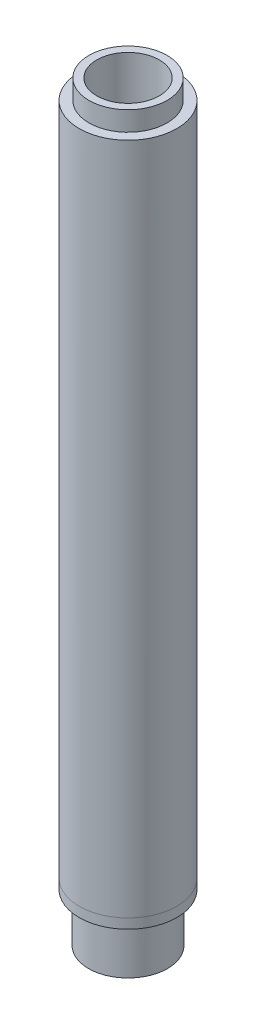
ISO-10303-21;
HEADER;
FILE_DESCRIPTION(('STEP AP214'),'2;1');
FILE_NAME('part.step','',(''),(''),'','','');
FILE_SCHEMA(('AUTOMOTIVE_DESIGN { 1 0 10303 214 1 1 1 1 }'));
ENDSEC;
DATA;
#1=APPLICATION_CONTEXT('core data for automotive mechanical design processes');
#2=APPLICATION_PROTOCOL_DEFINITION('international standard','automotive_design',2000,#1);
#3=PRODUCT_CONTEXT('',#1,'mechanical');
#4=PRODUCT('Part','Part','',(#3));
#5=PRODUCT_RELATED_PRODUCT_CATEGORY('part','',(#4));
#6=PRODUCT_DEFINITION_FORMATION('','',#4);
#7=PRODUCT_DEFINITION_CONTEXT('part definition',#1,'design');
#8=PRODUCT_DEFINITION('design','',#6,#7);
#9=PRODUCT_DEFINITION_SHAPE('','',#8);
#10=(LENGTH_UNIT() NAMED_UNIT(*) SI_UNIT(.MILLI.,.METRE.));
#11=(NAMED_UNIT(*) PLANE_ANGLE_UNIT() SI_UNIT($,.RADIAN.));
#12=(NAMED_UNIT(*) SI_UNIT($,.STERADIAN.) SOLID_ANGLE_UNIT());
#13=UNCERTAINTY_MEASURE_WITH_UNIT(LENGTH_MEASURE(1.E-05),#10,'distance_accuracy_value','');
#14=(GEOMETRIC_REPRESENTATION_CONTEXT(3) GLOBAL_UNCERTAINTY_ASSIGNED_CONTEXT((#13)) GLOBAL_UNIT_ASSIGNED_CONTEXT((#10,
#11,#12)) REPRESENTATION_CONTEXT('',''));
#15=CARTESIAN_POINT('',(0.,0.,0.));
#16=DIRECTION('',(0.,0.,1.));
#17=DIRECTION('',(1.,0.,0.));
#18=AXIS2_PLACEMENT_3D('',#15,#16,#17);
#19=CARTESIAN_POINT('',(0.,2.54,0.));
#20=DIRECTION('',(0.,-1.,0.));
#21=DIRECTION('',(0.,0.,-1.));
#22=AXIS2_PLACEMENT_3D('',#19,#20,#21);
#23=PLANE('',#22);
#24=CARTESIAN_POINT('',(0.,2.53999999999999,0.));
#25=DIRECTION('',(0.,-1.,0.));
#26=DIRECTION('',(0.,0.,-1.));
#27=AXIS2_PLACEMENT_3D('',#24,#25,#26);
#28=CIRCLE('',#27,12.7);
#29=CARTESIAN_POINT('',(0.,2.53999999999999,-12.7));
#30=VERTEX_POINT('',#29);
#31=EDGE_CURVE('E67',#30,#30,#28,.T.);
#32=ORIENTED_EDGE('',*,*,#31,.T.);
#33=EDGE_LOOP('',(#32));
#34=FACE_BOUND('',#33,.T.);
#35=CARTESIAN_POINT('',(0.,2.54,0.));
#36=DIRECTION('',(0.,-1.,0.));
#37=DIRECTION('',(0.,0.,-1.));
#38=AXIS2_PLACEMENT_3D('',#35,#36,#37);
#39=CIRCLE('',#38,8.128);
#40=CARTESIAN_POINT('',(0.,2.54,-8.128));
#41=VERTEX_POINT('',#40);
#42=EDGE_CURVE('E55',#41,#41,#39,.F.);
#43=ORIENTED_EDGE('',*,*,#42,.T.);
#44=EDGE_LOOP('',(#43));
#45=FACE_BOUND('',#44,.T.);
#46=ADVANCED_FACE('F51',(#34,#45),#23,.T.);
#47=CARTESIAN_POINT('',(0.,177.8,0.));
#48=DIRECTION('',(0.,-1.,0.));
#49=DIRECTION('',(0.,0.,-1.));
#50=AXIS2_PLACEMENT_3D('',#47,#48,#49);
#51=CYLINDRICAL_SURFACE('',#50,12.7);
#52=CARTESIAN_POINT('',(0.,177.8,0.));
#53=DIRECTION('',(0.,1.,0.));
#54=DIRECTION('',(0.,0.,1.));
#55=AXIS2_PLACEMENT_3D('',#52,#53,#54);
#56=CIRCLE('',#55,12.7);
#57=CARTESIAN_POINT('',(0.,177.8,12.7));
#58=VERTEX_POINT('',#57);
#59=EDGE_CURVE('E64',#58,#58,#56,.T.);
#60=ORIENTED_EDGE('',*,*,#59,.F.);
#61=EDGE_LOOP('',(#60));
#62=FACE_BOUND('',#61,.T.);
#63=ORIENTED_EDGE('',*,*,#31,.F.);
#64=EDGE_LOOP('',(#63));
#65=FACE_BOUND('',#64,.T.);
#66=ADVANCED_FACE('F53',(#62,#65),#51,.T.);
#67=CARTESIAN_POINT('',(0.,0.,0.));
#68=DIRECTION('',(0.,1.,0.));
#69=DIRECTION('',(0.,0.,1.));
#70=AXIS2_PLACEMENT_3D('',#67,#68,#69);
#71=CYLINDRICAL_SURFACE('',#70,8.128);
#72=CARTESIAN_POINT('',(0.,182.88,0.));
#73=DIRECTION('',(0.,1.,0.));
#74=DIRECTION('',(0.,0.,1.));
#75=AXIS2_PLACEMENT_3D('',#72,#73,#74);
#76=CIRCLE('',#75,8.128);
#77=CARTESIAN_POINT('',(0.,182.88,8.128));
#78=VERTEX_POINT('',#77);
#79=EDGE_CURVE('E11',#78,#78,#76,.T.);
#80=ORIENTED_EDGE('',*,*,#79,.T.);
#81=EDGE_LOOP('',(#80));
#82=FACE_BOUND('',#81,.T.);
#83=ORIENTED_EDGE('',*,*,#42,.F.);
#84=EDGE_LOOP('',(#83));
#85=FACE_BOUND('',#84,.T.);
#86=ADVANCED_FACE('F77',(#82,#85),#71,.F.);
#87=CARTESIAN_POINT('',(0.,177.8,0.));
#88=DIRECTION('',(0.,1.,0.));
#89=DIRECTION('',(0.,0.,1.));
#90=AXIS2_PLACEMENT_3D('',#87,#88,#89);
#91=PLANE('',#90);
#92=CARTESIAN_POINT('',(0.,177.8,0.));
#93=DIRECTION('',(0.,1.,0.));
#94=DIRECTION('',(0.,0.,1.));
#95=AXIS2_PLACEMENT_3D('',#92,#93,#94);
#96=CIRCLE('',#95,10.16);
#97=CARTESIAN_POINT('',(0.,177.8,10.16));
#98=VERTEX_POINT('',#97);
#99=EDGE_CURVE('E69',#98,#98,#96,.T.);
#100=ORIENTED_EDGE('',*,*,#99,.F.);
#101=EDGE_LOOP('',(#100));
#102=FACE_BOUND('',#101,.T.);
#103=ORIENTED_EDGE('',*,*,#59,.T.);
#104=EDGE_LOOP('',(#103));
#105=FACE_BOUND('',#104,.T.);
#106=ADVANCED_FACE('F79',(#102,#105),#91,.T.);
#107=CARTESIAN_POINT('',(0.,182.88,0.));
#108=DIRECTION('',(0.,-1.,0.));
#109=DIRECTION('',(0.,0.,-1.));
#110=AXIS2_PLACEMENT_3D('',#107,#108,#109);
#111=CYLINDRICAL_SURFACE('',#110,10.16);
#112=CARTESIAN_POINT('',(0.,182.88,0.));
#113=DIRECTION('',(0.,1.,0.));
#114=DIRECTION('',(0.,0.,1.));
#115=AXIS2_PLACEMENT_3D('',#112,#113,#114);
#116=CIRCLE('',#115,10.16);
#117=CARTESIAN_POINT('',(0.,182.88,10.16));
#118=VERTEX_POINT('',#117);
#119=EDGE_CURVE('E59',#118,#118,#116,.T.);
#120=ORIENTED_EDGE('',*,*,#119,.F.);
#121=EDGE_LOOP('',(#120));
#122=FACE_BOUND('',#121,.T.);
#123=ORIENTED_EDGE('',*,*,#99,.T.);
#124=EDGE_LOOP('',(#123));
#125=FACE_BOUND('',#124,.T.);
#126=ADVANCED_FACE('F84',(#122,#125),#111,.T.);
#127=CARTESIAN_POINT('',(0.,182.88,0.));
#128=DIRECTION('',(0.,1.,0.));
#129=DIRECTION('',(0.,0.,1.));
#130=AXIS2_PLACEMENT_3D('',#127,#128,#129);
#131=PLANE('',#130);
#132=ORIENTED_EDGE('',*,*,#79,.F.);
#133=EDGE_LOOP('',(#132));
#134=FACE_BOUND('',#133,.T.);
#135=ORIENTED_EDGE('',*,*,#119,.T.);
#136=EDGE_LOOP('',(#135));
#137=FACE_BOUND('',#136,.T.);
#138=ADVANCED_FACE('F92',(#134,#137),#131,.T.);
#139=CLOSED_SHELL('',(#46,#66,#86,#106,#126,#138));
#140=MANIFOLD_SOLID_BREP('B2',#139);
#141=CARTESIAN_POINT('',(0.,2.54,0.));
#142=DIRECTION('',(0.,-1.,0.));
#143=DIRECTION('',(0.,0.,-1.));
#144=AXIS2_PLACEMENT_3D('',#141,#142,#143);
#145=PLANE('',#144);
#146=CARTESIAN_POINT('',(0.,2.54,0.));
#147=DIRECTION('',(0.,-1.,0.));
#148=DIRECTION('',(0.,0.,-1.));
#149=AXIS2_PLACEMENT_3D('',#146,#147,#148);
#150=CIRCLE('',#149,8.128);
#151=CARTESIAN_POINT('',(0.,2.54,-8.128));
#152=VERTEX_POINT('',#151);
#153=EDGE_CURVE('E156',#152,#152,#150,.F.);
#154=ORIENTED_EDGE('',*,*,#153,.F.);
#155=EDGE_LOOP('',(#154));
#156=FACE_BOUND('',#155,.T.);
#157=CARTESIAN_POINT('',(0.,2.53999999999999,0.));
#158=DIRECTION('',(0.,-1.,0.));
#159=DIRECTION('',(0.,0.,-1.));
#160=AXIS2_PLACEMENT_3D('',#157,#158,#159);
#161=CIRCLE('',#160,12.7);
#162=CARTESIAN_POINT('',(0.,2.53999999999999,-12.7));
#163=VERTEX_POINT('',#162);
#164=EDGE_CURVE('E50',#163,#163,#161,.T.);
#165=ORIENTED_EDGE('',*,*,#164,.F.);
#166=EDGE_LOOP('',(#165));
#167=FACE_BOUND('',#166,.T.);
#168=ADVANCED_FACE('F150',(#156,#167),#145,.F.);
#169=CARTESIAN_POINT('',(0.,-12.7,0.));
#170=DIRECTION('',(0.,1.,0.));
#171=DIRECTION('',(0.,0.,1.));
#172=AXIS2_PLACEMENT_3D('',#169,#170,#171);
#173=CYLINDRICAL_SURFACE('',#172,10.287);
#174=CARTESIAN_POINT('',(0.,-12.7,0.));
#175=DIRECTION('',(0.,-1.,0.));
#176=DIRECTION('',(0.,0.,-1.));
#177=AXIS2_PLACEMENT_3D('',#174,#175,#176);
#178=CIRCLE('',#177,10.287);
#179=CARTESIAN_POINT('',(0.,-12.7,-10.287));
#180=VERTEX_POINT('',#179);
#181=EDGE_CURVE('E169',#180,#180,#178,.T.);
#182=ORIENTED_EDGE('',*,*,#181,.F.);
#183=EDGE_LOOP('',(#182));
#184=FACE_BOUND('',#183,.T.);
#185=CARTESIAN_POINT('',(0.,0.,0.));
#186=DIRECTION('',(0.,1.,0.));
#187=DIRECTION('',(0.,0.,1.));
#188=AXIS2_PLACEMENT_3D('',#185,#186,#187);
#189=CIRCLE('',#188,10.287);
#190=CARTESIAN_POINT('',(0.,0.,10.287));
#191=VERTEX_POINT('',#190);
#192=EDGE_CURVE('E160',#191,#191,#189,.F.);
#193=ORIENTED_EDGE('',*,*,#192,.T.);
#194=EDGE_LOOP('',(#193));
#195=FACE_BOUND('',#194,.T.);
#196=ADVANCED_FACE('F180',(#184,#195),#173,.T.);
#197=CARTESIAN_POINT('',(0.,-12.7,0.));
#198=DIRECTION('',(0.,-1.,0.));
#199=DIRECTION('',(0.,0.,-1.));
#200=AXIS2_PLACEMENT_3D('',#197,#198,#199);
#201=PLANE('',#200);
#202=ORIENTED_EDGE('',*,*,#181,.T.);
#203=EDGE_LOOP('',(#202));
#204=FACE_BOUND('',#203,.T.);
#205=CARTESIAN_POINT('',(0.,-12.7,0.));
#206=DIRECTION('',(0.,-1.,0.));
#207=DIRECTION('',(0.,0.,-1.));
#208=AXIS2_PLACEMENT_3D('',#205,#206,#207);
#209=CIRCLE('',#208,8.128);
#210=CARTESIAN_POINT('',(0.,-12.7,-8.128));
#211=VERTEX_POINT('',#210);
#212=EDGE_CURVE('E172',#211,#211,#209,.T.);
#213=ORIENTED_EDGE('',*,*,#212,.F.);
#214=EDGE_LOOP('',(#213));
#215=FACE_BOUND('',#214,.T.);
#216=ADVANCED_FACE('F178',(#204,#215),#201,.T.);
#217=CARTESIAN_POINT('',(0.,0.,0.));
#218=DIRECTION('',(0.,1.,0.));
#219=DIRECTION('',(0.,0.,1.));
#220=AXIS2_PLACEMENT_3D('',#217,#218,#219);
#221=CYLINDRICAL_SURFACE('',#220,8.128);
#222=ORIENTED_EDGE('',*,*,#153,.T.);
#223=EDGE_LOOP('',(#222));
#224=FACE_BOUND('',#223,.T.);
#225=ORIENTED_EDGE('',*,*,#212,.T.);
#226=EDGE_LOOP('',(#225));
#227=FACE_BOUND('',#226,.T.);
#228=ADVANCED_FACE('F176',(#224,#227),#221,.F.);
#229=CARTESIAN_POINT('',(0.,0.,0.));
#230=DIRECTION('',(0.,1.,0.));
#231=DIRECTION('',(0.,0.,1.));
#232=AXIS2_PLACEMENT_3D('',#229,#230,#231);
#233=PLANE('',#232);
#234=CARTESIAN_POINT('',(0.,0.,0.));
#235=DIRECTION('',(0.,1.,0.));
#236=DIRECTION('',(0.,0.,1.));
#237=AXIS2_PLACEMENT_3D('',#234,#235,#236);
#238=CIRCLE('',#237,12.7);
#239=CARTESIAN_POINT('',(0.,0.,12.7));
#240=VERTEX_POINT('',#239);
#241=EDGE_CURVE('E164',#240,#240,#238,.T.);
#242=ORIENTED_EDGE('',*,*,#241,.F.);
#243=EDGE_LOOP('',(#242));
#244=FACE_BOUND('',#243,.T.);
#245=ORIENTED_EDGE('',*,*,#192,.F.);
#246=EDGE_LOOP('',(#245));
#247=FACE_BOUND('',#246,.T.);
#248=ADVANCED_FACE('F187',(#244,#247),#233,.F.);
#249=CARTESIAN_POINT('',(0.,177.8,0.));
#250=DIRECTION('',(0.,-1.,0.));
#251=DIRECTION('',(0.,0.,-1.));
#252=AXIS2_PLACEMENT_3D('',#249,#250,#251);
#253=CYLINDRICAL_SURFACE('',#252,12.7);
#254=ORIENTED_EDGE('',*,*,#164,.T.);
#255=EDGE_LOOP('',(#254));
#256=FACE_BOUND('',#255,.T.);
#257=ORIENTED_EDGE('',*,*,#241,.T.);
#258=EDGE_LOOP('',(#257));
#259=FACE_BOUND('',#258,.T.);
#260=ADVANCED_FACE('F193',(#256,#259),#253,.T.);
#261=CLOSED_SHELL('',(#168,#196,#216,#228,#248,#260));
#262=MANIFOLD_SOLID_BREP('B6',#261);
#263=ADVANCED_BREP_SHAPE_REPRESENTATION('',(#18,#140,#262),#14);
#264=SHAPE_DEFINITION_REPRESENTATION(#9,#263);
ENDSEC;
END-ISO-10303-21;
